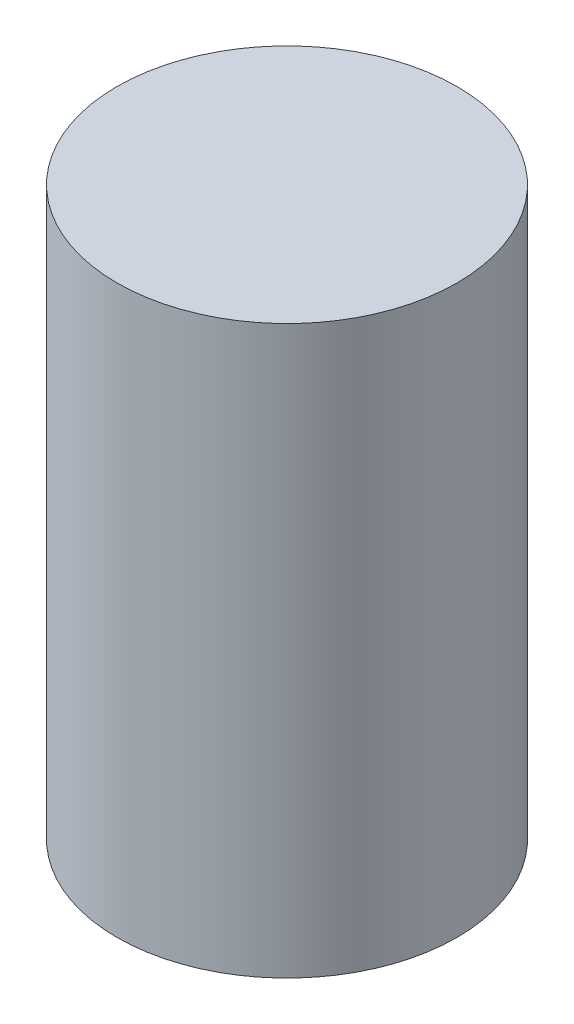
ISO-10303-21;
HEADER;
FILE_DESCRIPTION(('STEP AP214'),'2;1');
FILE_NAME('part.step','',(''),(''),'','','');
FILE_SCHEMA(('AUTOMOTIVE_DESIGN { 1 0 10303 214 1 1 1 1 }'));
ENDSEC;
DATA;
#1=APPLICATION_CONTEXT('core data for automotive mechanical design processes');
#2=APPLICATION_PROTOCOL_DEFINITION('international standard','automotive_design',2000,#1);
#3=PRODUCT_CONTEXT('',#1,'mechanical');
#4=PRODUCT('Part','Part','',(#3));
#5=PRODUCT_RELATED_PRODUCT_CATEGORY('part','',(#4));
#6=PRODUCT_DEFINITION_FORMATION('','',#4);
#7=PRODUCT_DEFINITION_CONTEXT('part definition',#1,'design');
#8=PRODUCT_DEFINITION('design','',#6,#7);
#9=PRODUCT_DEFINITION_SHAPE('','',#8);
#10=(LENGTH_UNIT() NAMED_UNIT(*) SI_UNIT(.MILLI.,.METRE.));
#11=(NAMED_UNIT(*) PLANE_ANGLE_UNIT() SI_UNIT($,.RADIAN.));
#12=(NAMED_UNIT(*) SI_UNIT($,.STERADIAN.) SOLID_ANGLE_UNIT());
#13=UNCERTAINTY_MEASURE_WITH_UNIT(LENGTH_MEASURE(1.E-05),#10,'distance_accuracy_value','');
#14=(GEOMETRIC_REPRESENTATION_CONTEXT(3) GLOBAL_UNCERTAINTY_ASSIGNED_CONTEXT((#13)) GLOBAL_UNIT_ASSIGNED_CONTEXT((#10,
#11,#12)) REPRESENTATION_CONTEXT('',''));
#15=CARTESIAN_POINT('',(0.,0.,0.));
#16=DIRECTION('',(0.,0.,1.));
#17=DIRECTION('',(1.,0.,0.));
#18=AXIS2_PLACEMENT_3D('',#15,#16,#17);
#19=CARTESIAN_POINT('',(0.,5.,0.));
#20=DIRECTION('',(0.,-1.,0.));
#21=DIRECTION('',(0.,0.,-1.));
#22=AXIS2_PLACEMENT_3D('',#19,#20,#21);
#23=CYLINDRICAL_SURFACE('',#22,1.5);
#24=CARTESIAN_POINT('',(0.,5.,0.));
#25=DIRECTION('',(0.,1.,0.));
#26=DIRECTION('',(0.,0.,1.));
#27=AXIS2_PLACEMENT_3D('',#24,#25,#26);
#28=CIRCLE('',#27,1.5);
#29=CARTESIAN_POINT('',(0.,5.,1.5));
#30=VERTEX_POINT('',#29);
#31=EDGE_CURVE('E10',#30,#30,#28,.T.);
#32=ORIENTED_EDGE('',*,*,#31,.F.);
#33=EDGE_LOOP('',(#32));
#34=FACE_BOUND('',#33,.T.);
#35=CARTESIAN_POINT('',(0.,0.,0.));
#36=DIRECTION('',(0.,1.,0.));
#37=DIRECTION('',(0.,0.,1.));
#38=AXIS2_PLACEMENT_3D('',#35,#36,#37);
#39=CIRCLE('',#38,1.5);
#40=CARTESIAN_POINT('',(0.,0.,1.5));
#41=VERTEX_POINT('',#40);
#42=EDGE_CURVE('E36',#41,#41,#39,.T.);
#43=ORIENTED_EDGE('',*,*,#42,.T.);
#44=EDGE_LOOP('',(#43));
#45=FACE_BOUND('',#44,.T.);
#46=ADVANCED_FACE('F33',(#34,#45),#23,.T.);
#47=CARTESIAN_POINT('',(0.,5.,0.));
#48=DIRECTION('',(0.,1.,0.));
#49=DIRECTION('',(0.,0.,1.));
#50=AXIS2_PLACEMENT_3D('',#47,#48,#49);
#51=PLANE('',#50);
#52=ORIENTED_EDGE('',*,*,#31,.T.);
#53=EDGE_LOOP('',(#52));
#54=FACE_BOUND('',#53,.T.);
#55=ADVANCED_FACE('F48',(#54),#51,.T.);
#56=CARTESIAN_POINT('',(0.,0.,0.));
#57=DIRECTION('',(0.,1.,0.));
#58=DIRECTION('',(0.,0.,1.));
#59=AXIS2_PLACEMENT_3D('',#56,#57,#58);
#60=PLANE('',#59);
#61=ORIENTED_EDGE('',*,*,#42,.F.);
#62=EDGE_LOOP('',(#61));
#63=FACE_BOUND('',#62,.T.);
#64=ADVANCED_FACE('F46',(#63),#60,.F.);
#65=CLOSED_SHELL('',(#46,#55,#64));
#66=MANIFOLD_SOLID_BREP('B2',#65);
#67=ADVANCED_BREP_SHAPE_REPRESENTATION('',(#18,#66),#14);
#68=SHAPE_DEFINITION_REPRESENTATION(#9,#67);
ENDSEC;
END-ISO-10303-21;
